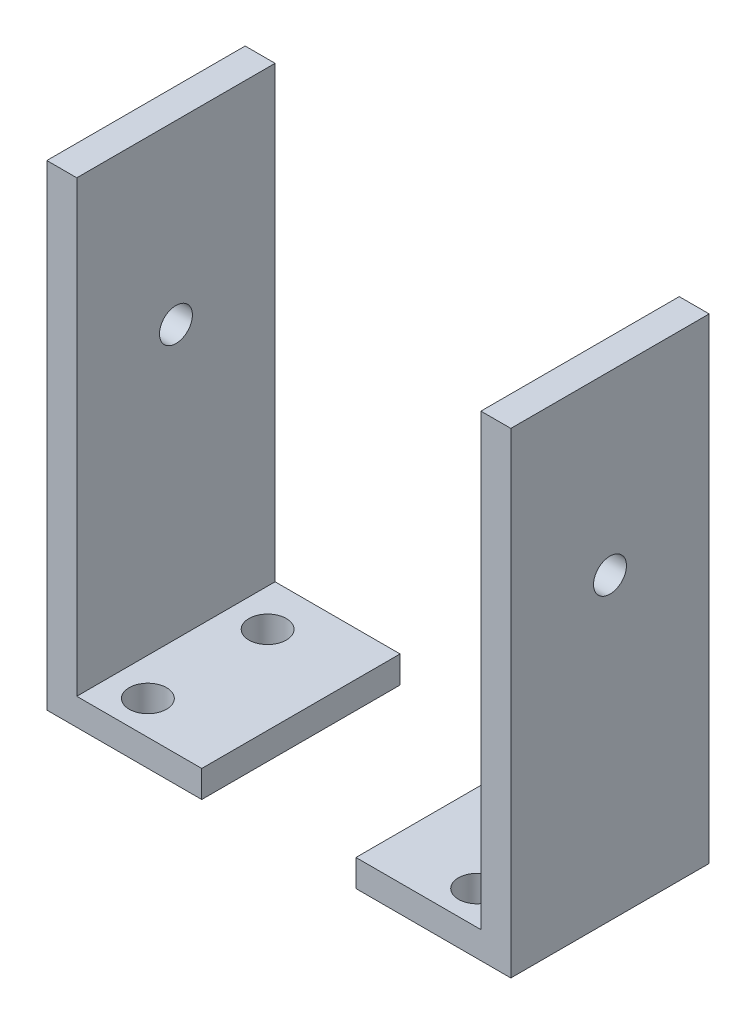
ISO-10303-21;
HEADER;
FILE_DESCRIPTION(('STEP AP214'),'2;1');
FILE_NAME('part.step','',(''),(''),'','','');
FILE_SCHEMA(('AUTOMOTIVE_DESIGN { 1 0 10303 214 1 1 1 1 }'));
ENDSEC;
DATA;
#1=APPLICATION_CONTEXT('core data for automotive mechanical design processes');
#2=APPLICATION_PROTOCOL_DEFINITION('international standard','automotive_design',2000,#1);
#3=PRODUCT_CONTEXT('',#1,'mechanical');
#4=PRODUCT('Part','Part','',(#3));
#5=PRODUCT_RELATED_PRODUCT_CATEGORY('part','',(#4));
#6=PRODUCT_DEFINITION_FORMATION('','',#4);
#7=PRODUCT_DEFINITION_CONTEXT('part definition',#1,'design');
#8=PRODUCT_DEFINITION('design','',#6,#7);
#9=PRODUCT_DEFINITION_SHAPE('','',#8);
#10=(LENGTH_UNIT() NAMED_UNIT(*) SI_UNIT(.MILLI.,.METRE.));
#11=(NAMED_UNIT(*) PLANE_ANGLE_UNIT() SI_UNIT($,.RADIAN.));
#12=(NAMED_UNIT(*) SI_UNIT($,.STERADIAN.) SOLID_ANGLE_UNIT());
#13=UNCERTAINTY_MEASURE_WITH_UNIT(LENGTH_MEASURE(1.E-05),#10,'distance_accuracy_value','');
#14=(GEOMETRIC_REPRESENTATION_CONTEXT(3) GLOBAL_UNCERTAINTY_ASSIGNED_CONTEXT((#13)) GLOBAL_UNIT_ASSIGNED_CONTEXT((#10,
#11,#12)) REPRESENTATION_CONTEXT('',''));
#15=CARTESIAN_POINT('',(0.,0.,0.));
#16=DIRECTION('',(0.,0.,1.));
#17=DIRECTION('',(1.,0.,0.));
#18=AXIS2_PLACEMENT_3D('',#15,#16,#17);
#19=CARTESIAN_POINT('',(2.,31.8,-13.25));
#20=DIRECTION('',(-1.,0.,0.));
#21=DIRECTION('',(0.,0.,1.));
#22=AXIS2_PLACEMENT_3D('',#19,#20,#21);
#23=PLANE('',#22);
#24=CARTESIAN_POINT('',(2.,20.,-6.625));
#25=DIRECTION('',(-1.,0.,0.));
#26=DIRECTION('',(0.,0.,1.));
#27=AXIS2_PLACEMENT_3D('',#24,#25,#26);
#28=CIRCLE('',#27,1.1);
#29=CARTESIAN_POINT('',(2.,20.,-5.525));
#30=VERTEX_POINT('',#29);
#31=EDGE_CURVE('E134',#30,#30,#28,.T.);
#32=ORIENTED_EDGE('',*,*,#31,.T.);
#33=EDGE_LOOP('',(#32));
#34=FACE_BOUND('',#33,.T.);
#35=DIRECTION('',(0.,0.,-1.));
#36=VECTOR('',#35,1.);
#37=CARTESIAN_POINT('',(2.,1.8,-13.25));
#38=LINE('',#37,#36);
#39=CARTESIAN_POINT('',(2.,1.8,0.));
#40=VERTEX_POINT('',#39);
#41=CARTESIAN_POINT('',(2.,1.8,-13.25));
#42=VERTEX_POINT('',#41);
#43=EDGE_CURVE('E129',#40,#42,#38,.T.);
#44=ORIENTED_EDGE('',*,*,#43,.T.);
#45=DIRECTION('',(0.,-1.,0.));
#46=VECTOR('',#45,1.);
#47=CARTESIAN_POINT('',(2.,31.8,-13.25));
#48=LINE('',#47,#46);
#49=CARTESIAN_POINT('',(2.,31.8,-13.25));
#50=VERTEX_POINT('',#49);
#51=EDGE_CURVE('E117',#50,#42,#48,.T.);
#52=ORIENTED_EDGE('',*,*,#51,.F.);
#53=DIRECTION('',(0.,0.,-1.));
#54=VECTOR('',#53,1.);
#55=CARTESIAN_POINT('',(2.,31.8,-13.25));
#56=LINE('',#55,#54);
#57=CARTESIAN_POINT('',(2.,31.8,0.));
#58=VERTEX_POINT('',#57);
#59=EDGE_CURVE('E138',#58,#50,#56,.T.);
#60=ORIENTED_EDGE('',*,*,#59,.F.);
#61=DIRECTION('',(0.,-1.,0.));
#62=VECTOR('',#61,1.);
#63=CARTESIAN_POINT('',(2.,31.8,0.));
#64=LINE('',#63,#62);
#65=EDGE_CURVE('E125',#58,#40,#64,.T.);
#66=ORIENTED_EDGE('',*,*,#65,.T.);
#67=EDGE_LOOP('',(#44,#52,#60,#66));
#68=FACE_BOUND('',#67,.T.);
#69=ADVANCED_FACE('F49',(#34,#68),#23,.F.);
#70=CARTESIAN_POINT('',(0.,31.8,0.));
#71=DIRECTION('',(0.,1.,0.));
#72=DIRECTION('',(0.,0.,1.));
#73=AXIS2_PLACEMENT_3D('',#70,#71,#72);
#74=PLANE('',#73);
#75=DIRECTION('',(0.,0.,1.));
#76=VECTOR('',#75,1.);
#77=CARTESIAN_POINT('',(0.,31.8,-13.25));
#78=LINE('',#77,#76);
#79=CARTESIAN_POINT('',(0.,31.8,-13.25));
#80=VERTEX_POINT('',#79);
#81=CARTESIAN_POINT('',(0.,31.8,0.));
#82=VERTEX_POINT('',#81);
#83=EDGE_CURVE('E128',#80,#82,#78,.T.);
#84=ORIENTED_EDGE('',*,*,#83,.T.);
#85=DIRECTION('',(1.,0.,0.));
#86=VECTOR('',#85,1.);
#87=CARTESIAN_POINT('',(0.,31.8,0.));
#88=LINE('',#87,#86);
#89=EDGE_CURVE('E140',#82,#58,#88,.T.);
#90=ORIENTED_EDGE('',*,*,#89,.T.);
#91=ORIENTED_EDGE('',*,*,#59,.T.);
#92=DIRECTION('',(-1.,0.,0.));
#93=VECTOR('',#92,1.);
#94=CARTESIAN_POINT('',(0.,31.8,-13.25));
#95=LINE('',#94,#93);
#96=EDGE_CURVE('E135',#50,#80,#95,.T.);
#97=ORIENTED_EDGE('',*,*,#96,.T.);
#98=EDGE_LOOP('',(#84,#90,#91,#97));
#99=FACE_BOUND('',#98,.T.);
#100=ADVANCED_FACE('F191',(#99),#74,.T.);
#101=CARTESIAN_POINT('',(0.,1.8,0.));
#102=DIRECTION('',(1.,0.,0.));
#103=DIRECTION('',(0.,0.,-1.));
#104=AXIS2_PLACEMENT_3D('',#101,#102,#103);
#105=PLANE('',#104);
#106=CARTESIAN_POINT('',(0.,20.,-6.625));
#107=DIRECTION('',(1.,0.,0.));
#108=DIRECTION('',(0.,0.,-1.));
#109=AXIS2_PLACEMENT_3D('',#106,#107,#108);
#110=CIRCLE('',#109,1.1);
#111=CARTESIAN_POINT('',(0.,20.,-7.725));
#112=VERTEX_POINT('',#111);
#113=EDGE_CURVE('E111',#112,#112,#110,.F.);
#114=ORIENTED_EDGE('',*,*,#113,.F.);
#115=EDGE_LOOP('',(#114));
#116=FACE_BOUND('',#115,.T.);
#117=DIRECTION('',(0.,0.,1.));
#118=VECTOR('',#117,1.);
#119=CARTESIAN_POINT('',(0.,0.,0.));
#120=LINE('',#119,#118);
#121=CARTESIAN_POINT('',(0.,0.,-13.25));
#122=VERTEX_POINT('',#121);
#123=CARTESIAN_POINT('',(0.,0.,0.));
#124=VERTEX_POINT('',#123);
#125=EDGE_CURVE('E122',#122,#124,#120,.T.);
#126=ORIENTED_EDGE('',*,*,#125,.T.);
#127=DIRECTION('',(0.,-1.,0.));
#128=VECTOR('',#127,1.);
#129=CARTESIAN_POINT('',(0.,1.8,0.));
#130=LINE('',#129,#128);
#131=EDGE_CURVE('E145',#82,#124,#130,.T.);
#132=ORIENTED_EDGE('',*,*,#131,.F.);
#133=ORIENTED_EDGE('',*,*,#83,.F.);
#134=DIRECTION('',(0.,-1.,0.));
#135=VECTOR('',#134,1.);
#136=CARTESIAN_POINT('',(0.,1.8,-13.25));
#137=LINE('',#136,#135);
#138=EDGE_CURVE('E179',#80,#122,#137,.T.);
#139=ORIENTED_EDGE('',*,*,#138,.T.);
#140=EDGE_LOOP('',(#126,#132,#133,#139));
#141=FACE_BOUND('',#140,.T.);
#142=ADVANCED_FACE('F189',(#116,#141),#105,.F.);
#143=CARTESIAN_POINT('',(0.,1.8,-13.25));
#144=DIRECTION('',(0.,0.,1.));
#145=DIRECTION('',(1.,0.,0.));
#146=AXIS2_PLACEMENT_3D('',#143,#144,#145);
#147=PLANE('',#146);
#148=DIRECTION('',(-1.,0.,0.));
#149=VECTOR('',#148,1.);
#150=CARTESIAN_POINT('',(0.,1.8,-13.25));
#151=LINE('',#150,#149);
#152=CARTESIAN_POINT('',(10.3492087080825,1.8,-13.25));
#153=VERTEX_POINT('',#152);
#154=EDGE_CURVE('E103',#153,#42,#151,.T.);
#155=ORIENTED_EDGE('',*,*,#154,.F.);
#156=DIRECTION('',(0.,1.,0.));
#157=VECTOR('',#156,1.);
#158=CARTESIAN_POINT('',(10.3492087080825,-16.7834771049259,-13.25));
#159=LINE('',#158,#157);
#160=CARTESIAN_POINT('',(10.3492087080825,0.,-13.25));
#161=VERTEX_POINT('',#160);
#162=EDGE_CURVE('E98',#161,#153,#159,.T.);
#163=ORIENTED_EDGE('',*,*,#162,.F.);
#164=DIRECTION('',(-1.,0.,0.));
#165=VECTOR('',#164,1.);
#166=CARTESIAN_POINT('',(0.,0.,-13.25));
#167=LINE('',#166,#165);
#168=EDGE_CURVE('E132',#161,#122,#167,.T.);
#169=ORIENTED_EDGE('',*,*,#168,.T.);
#170=ORIENTED_EDGE('',*,*,#138,.F.);
#171=ORIENTED_EDGE('',*,*,#96,.F.);
#172=ORIENTED_EDGE('',*,*,#51,.T.);
#173=EDGE_LOOP('',(#155,#163,#169,#170,#171,#172));
#174=FACE_BOUND('',#173,.T.);
#175=ADVANCED_FACE('F114',(#174),#147,.F.);
#176=CARTESIAN_POINT('',(0.,1.8,0.));
#177=DIRECTION('',(0.,0.,-1.));
#178=DIRECTION('',(-1.,0.,0.));
#179=AXIS2_PLACEMENT_3D('',#176,#177,#178);
#180=PLANE('',#179);
#181=DIRECTION('',(1.,0.,0.));
#182=VECTOR('',#181,1.);
#183=CARTESIAN_POINT('',(0.,0.,0.));
#184=LINE('',#183,#182);
#185=CARTESIAN_POINT('',(10.3492087080825,0.,0.));
#186=VERTEX_POINT('',#185);
#187=EDGE_CURVE('E131',#124,#186,#184,.T.);
#188=ORIENTED_EDGE('',*,*,#187,.T.);
#189=DIRECTION('',(0.,1.,0.));
#190=VECTOR('',#189,1.);
#191=CARTESIAN_POINT('',(10.3492087080825,-16.7834771049259,0.));
#192=LINE('',#191,#190);
#193=CARTESIAN_POINT('',(10.3492087080825,1.8,0.));
#194=VERTEX_POINT('',#193);
#195=EDGE_CURVE('E144',#186,#194,#192,.T.);
#196=ORIENTED_EDGE('',*,*,#195,.T.);
#197=DIRECTION('',(1.,0.,0.));
#198=VECTOR('',#197,1.);
#199=CARTESIAN_POINT('',(0.,1.8,0.));
#200=LINE('',#199,#198);
#201=EDGE_CURVE('E110',#40,#194,#200,.T.);
#202=ORIENTED_EDGE('',*,*,#201,.F.);
#203=ORIENTED_EDGE('',*,*,#65,.F.);
#204=ORIENTED_EDGE('',*,*,#89,.F.);
#205=ORIENTED_EDGE('',*,*,#131,.T.);
#206=EDGE_LOOP('',(#188,#196,#202,#203,#204,#205));
#207=FACE_BOUND('',#206,.T.);
#208=ADVANCED_FACE('F163',(#207),#180,.F.);
#209=CARTESIAN_POINT('',(0.,0.,0.));
#210=DIRECTION('',(0.,-1.,0.));
#211=DIRECTION('',(0.,0.,-1.));
#212=AXIS2_PLACEMENT_3D('',#209,#210,#211);
#213=PLANE('',#212);
#214=DIRECTION('',(0.,0.,1.));
#215=VECTOR('',#214,1.);
#216=CARTESIAN_POINT('',(10.3492087080825,0.,-13.25));
#217=LINE('',#216,#215);
#218=EDGE_CURVE('E66',#161,#186,#217,.T.);
#219=ORIENTED_EDGE('',*,*,#218,.T.);
#220=ORIENTED_EDGE('',*,*,#187,.F.);
#221=ORIENTED_EDGE('',*,*,#125,.F.);
#222=ORIENTED_EDGE('',*,*,#168,.F.);
#223=EDGE_LOOP('',(#219,#220,#221,#222));
#224=FACE_BOUND('',#223,.T.);
#225=CARTESIAN_POINT('',(4.5,0.,-10.25));
#226=DIRECTION('',(0.,-1.,0.));
#227=DIRECTION('',(0.,0.,-1.));
#228=AXIS2_PLACEMENT_3D('',#225,#226,#227);
#229=CIRCLE('',#228,1.25);
#230=CARTESIAN_POINT('',(4.5,0.,-11.5));
#231=VERTEX_POINT('',#230);
#232=EDGE_CURVE('E53',#231,#231,#229,.T.);
#233=ORIENTED_EDGE('',*,*,#232,.F.);
#234=EDGE_LOOP('',(#233));
#235=FACE_BOUND('',#234,.T.);
#236=CARTESIAN_POINT('',(4.5,0.,-2.25));
#237=DIRECTION('',(0.,-1.,0.));
#238=DIRECTION('',(0.,0.,-1.));
#239=AXIS2_PLACEMENT_3D('',#236,#237,#238);
#240=CIRCLE('',#239,1.25);
#241=CARTESIAN_POINT('',(4.5,0.,-3.5));
#242=VERTEX_POINT('',#241);
#243=EDGE_CURVE('E12',#242,#242,#240,.T.);
#244=ORIENTED_EDGE('',*,*,#243,.F.);
#245=EDGE_LOOP('',(#244));
#246=FACE_BOUND('',#245,.T.);
#247=ADVANCED_FACE('F160',(#224,#235,#246),#213,.T.);
#248=CARTESIAN_POINT('',(0.,1.8,0.));
#249=DIRECTION('',(0.,-1.,0.));
#250=DIRECTION('',(0.,0.,-1.));
#251=AXIS2_PLACEMENT_3D('',#248,#249,#250);
#252=PLANE('',#251);
#253=CARTESIAN_POINT('',(4.5,1.8,-2.25));
#254=DIRECTION('',(0.,-1.,0.));
#255=DIRECTION('',(0.,0.,-1.));
#256=AXIS2_PLACEMENT_3D('',#253,#254,#255);
#257=CIRCLE('',#256,1.25);
#258=CARTESIAN_POINT('',(4.5,1.8,-3.5));
#259=VERTEX_POINT('',#258);
#260=EDGE_CURVE('E147',#259,#259,#257,.T.);
#261=ORIENTED_EDGE('',*,*,#260,.T.);
#262=EDGE_LOOP('',(#261));
#263=FACE_BOUND('',#262,.T.);
#264=CARTESIAN_POINT('',(4.5,1.8,-10.25));
#265=DIRECTION('',(0.,-1.,0.));
#266=DIRECTION('',(0.,0.,-1.));
#267=AXIS2_PLACEMENT_3D('',#264,#265,#266);
#268=CIRCLE('',#267,1.25);
#269=CARTESIAN_POINT('',(4.5,1.8,-11.5));
#270=VERTEX_POINT('',#269);
#271=EDGE_CURVE('E119',#270,#270,#268,.T.);
#272=ORIENTED_EDGE('',*,*,#271,.T.);
#273=EDGE_LOOP('',(#272));
#274=FACE_BOUND('',#273,.T.);
#275=ORIENTED_EDGE('',*,*,#201,.T.);
#276=DIRECTION('',(0.,0.,1.));
#277=VECTOR('',#276,1.);
#278=CARTESIAN_POINT('',(10.3492087080825,1.8,-13.25));
#279=LINE('',#278,#277);
#280=EDGE_CURVE('E96',#153,#194,#279,.T.);
#281=ORIENTED_EDGE('',*,*,#280,.F.);
#282=ORIENTED_EDGE('',*,*,#154,.T.);
#283=ORIENTED_EDGE('',*,*,#43,.F.);
#284=EDGE_LOOP('',(#275,#281,#282,#283));
#285=FACE_BOUND('',#284,.T.);
#286=ADVANCED_FACE('F107',(#263,#274,#285),#252,.F.);
#287=CARTESIAN_POINT('',(10.3492087080825,-16.7834771049259,-13.25));
#288=DIRECTION('',(-1.,0.,0.));
#289=DIRECTION('',(0.,0.,1.));
#290=AXIS2_PLACEMENT_3D('',#287,#288,#289);
#291=PLANE('',#290);
#292=ORIENTED_EDGE('',*,*,#162,.T.);
#293=ORIENTED_EDGE('',*,*,#280,.T.);
#294=ORIENTED_EDGE('',*,*,#195,.F.);
#295=ORIENTED_EDGE('',*,*,#218,.F.);
#296=EDGE_LOOP('',(#292,#293,#294,#295));
#297=FACE_BOUND('',#296,.T.);
#298=ADVANCED_FACE('F99',(#297),#291,.F.);
#299=CARTESIAN_POINT('',(-3.11126983722081,20.,-6.625));
#300=DIRECTION('',(1.,0.,0.));
#301=DIRECTION('',(0.,0.,-1.));
#302=AXIS2_PLACEMENT_3D('',#299,#300,#301);
#303=CYLINDRICAL_SURFACE('',#302,1.1);
#304=ORIENTED_EDGE('',*,*,#113,.T.);
#305=EDGE_LOOP('',(#304));
#306=FACE_BOUND('',#305,.T.);
#307=ORIENTED_EDGE('',*,*,#31,.F.);
#308=EDGE_LOOP('',(#307));
#309=FACE_BOUND('',#308,.T.);
#310=ADVANCED_FACE('F206',(#306,#309),#303,.F.);
#311=CARTESIAN_POINT('',(4.5,10.,-10.25));
#312=DIRECTION('',(0.,-1.,0.));
#313=DIRECTION('',(0.,0.,-1.));
#314=AXIS2_PLACEMENT_3D('',#311,#312,#313);
#315=CYLINDRICAL_SURFACE('',#314,1.25);
#316=ORIENTED_EDGE('',*,*,#232,.T.);
#317=EDGE_LOOP('',(#316));
#318=FACE_BOUND('',#317,.T.);
#319=ORIENTED_EDGE('',*,*,#271,.F.);
#320=EDGE_LOOP('',(#319));
#321=FACE_BOUND('',#320,.T.);
#322=ADVANCED_FACE('F157',(#318,#321),#315,.F.);
#323=CARTESIAN_POINT('',(4.5,10.,-2.25));
#324=DIRECTION('',(0.,-1.,0.));
#325=DIRECTION('',(0.,0.,-1.));
#326=AXIS2_PLACEMENT_3D('',#323,#324,#325);
#327=CYLINDRICAL_SURFACE('',#326,1.25);
#328=ORIENTED_EDGE('',*,*,#243,.T.);
#329=EDGE_LOOP('',(#328));
#330=FACE_BOUND('',#329,.T.);
#331=ORIENTED_EDGE('',*,*,#260,.F.);
#332=EDGE_LOOP('',(#331));
#333=FACE_BOUND('',#332,.T.);
#334=ADVANCED_FACE('F51',(#330,#333),#327,.F.);
#335=CLOSED_SHELL('',(#69,#100,#142,#175,#208,#247,#286,#298,#310,#322,#334));
#336=MANIFOLD_SOLID_BREP('B2',#335);
#337=CARTESIAN_POINT('',(0.,1.8,0.));
#338=DIRECTION('',(0.,-1.,0.));
#339=DIRECTION('',(0.,0.,-1.));
#340=AXIS2_PLACEMENT_3D('',#337,#338,#339);
#341=PLANE('',#340);
#342=CARTESIAN_POINT('',(26.5,1.8,-2.25));
#343=DIRECTION('',(0.,-1.,0.));
#344=DIRECTION('',(0.,0.,-1.));
#345=AXIS2_PLACEMENT_3D('',#342,#343,#344);
#346=CIRCLE('',#345,1.25);
#347=CARTESIAN_POINT('',(26.5,1.8,-3.5));
#348=VERTEX_POINT('',#347);
#349=EDGE_CURVE('E472',#348,#348,#346,.T.);
#350=ORIENTED_EDGE('',*,*,#349,.T.);
#351=EDGE_LOOP('',(#350));
#352=FACE_BOUND('',#351,.T.);
#353=CARTESIAN_POINT('',(26.5,1.8,-10.25));
#354=DIRECTION('',(0.,-1.,0.));
#355=DIRECTION('',(0.,0.,-1.));
#356=AXIS2_PLACEMENT_3D('',#353,#354,#355);
#357=CIRCLE('',#356,1.25);
#358=CARTESIAN_POINT('',(26.5,1.8,-11.5));
#359=VERTEX_POINT('',#358);
#360=EDGE_CURVE('E475',#359,#359,#357,.T.);
#361=ORIENTED_EDGE('',*,*,#360,.T.);
#362=EDGE_LOOP('',(#361));
#363=FACE_BOUND('',#362,.T.);
#364=DIRECTION('',(-1.,0.,0.));
#365=VECTOR('',#364,1.);
#366=CARTESIAN_POINT('',(0.,1.8,-13.25));
#367=LINE('',#366,#365);
#368=CARTESIAN_POINT('',(29.,1.8,-13.25));
#369=VERTEX_POINT('',#368);
#370=CARTESIAN_POINT('',(20.6507912919175,1.8,-13.25));
#371=VERTEX_POINT('',#370);
#372=EDGE_CURVE('E429',#369,#371,#367,.T.);
#373=ORIENTED_EDGE('',*,*,#372,.T.);
#374=DIRECTION('',(0.,0.,-1.));
#375=VECTOR('',#374,1.);
#376=CARTESIAN_POINT('',(20.6507912919175,1.8,-13.25));
#377=LINE('',#376,#375);
#378=CARTESIAN_POINT('',(20.6507912919175,1.8,0.));
#379=VERTEX_POINT('',#378);
#380=EDGE_CURVE('E427',#379,#371,#377,.T.);
#381=ORIENTED_EDGE('',*,*,#380,.F.);
#382=DIRECTION('',(1.,0.,0.));
#383=VECTOR('',#382,1.);
#384=CARTESIAN_POINT('',(0.,1.8,0.));
#385=LINE('',#384,#383);
#386=CARTESIAN_POINT('',(29.,1.8,0.));
#387=VERTEX_POINT('',#386);
#388=EDGE_CURVE('E420',#379,#387,#385,.T.);
#389=ORIENTED_EDGE('',*,*,#388,.T.);
#390=DIRECTION('',(0.,0.,1.));
#391=VECTOR('',#390,1.);
#392=CARTESIAN_POINT('',(29.,1.8,-13.25));
#393=LINE('',#392,#391);
#394=EDGE_CURVE('E424',#369,#387,#393,.T.);
#395=ORIENTED_EDGE('',*,*,#394,.F.);
#396=EDGE_LOOP('',(#373,#381,#389,#395));
#397=FACE_BOUND('',#396,.T.);
#398=ADVANCED_FACE('F371',(#352,#363,#397),#341,.F.);
#399=CARTESIAN_POINT('',(0.,0.,0.));
#400=DIRECTION('',(0.,-1.,0.));
#401=DIRECTION('',(0.,0.,-1.));
#402=AXIS2_PLACEMENT_3D('',#399,#400,#401);
#403=PLANE('',#402);
#404=DIRECTION('',(0.,0.,-1.));
#405=VECTOR('',#404,1.);
#406=CARTESIAN_POINT('',(20.6507912919175,0.,-13.25));
#407=LINE('',#406,#405);
#408=CARTESIAN_POINT('',(20.6507912919175,0.,0.));
#409=VERTEX_POINT('',#408);
#410=CARTESIAN_POINT('',(20.6507912919175,0.,-13.25));
#411=VERTEX_POINT('',#410);
#412=EDGE_CURVE('E388',#409,#411,#407,.T.);
#413=ORIENTED_EDGE('',*,*,#412,.T.);
#414=DIRECTION('',(-1.,0.,0.));
#415=VECTOR('',#414,1.);
#416=CARTESIAN_POINT('',(0.,0.,-13.25));
#417=LINE('',#416,#415);
#418=CARTESIAN_POINT('',(31.,0.,-13.25));
#419=VERTEX_POINT('',#418);
#420=EDGE_CURVE('E439',#419,#411,#417,.T.);
#421=ORIENTED_EDGE('',*,*,#420,.F.);
#422=DIRECTION('',(0.,0.,-1.));
#423=VECTOR('',#422,1.);
#424=CARTESIAN_POINT('',(31.,0.,0.));
#425=LINE('',#424,#423);
#426=CARTESIAN_POINT('',(31.,0.,0.));
#427=VERTEX_POINT('',#426);
#428=EDGE_CURVE('E461',#427,#419,#425,.T.);
#429=ORIENTED_EDGE('',*,*,#428,.F.);
#430=DIRECTION('',(1.,0.,0.));
#431=VECTOR('',#430,1.);
#432=CARTESIAN_POINT('',(0.,0.,0.));
#433=LINE('',#432,#431);
#434=EDGE_CURVE('E440',#409,#427,#433,.T.);
#435=ORIENTED_EDGE('',*,*,#434,.F.);
#436=EDGE_LOOP('',(#413,#421,#429,#435));
#437=FACE_BOUND('',#436,.T.);
#438=CARTESIAN_POINT('',(26.5,0.,-2.25));
#439=DIRECTION('',(0.,-1.,0.));
#440=DIRECTION('',(0.,0.,-1.));
#441=AXIS2_PLACEMENT_3D('',#438,#439,#440);
#442=CIRCLE('',#441,1.25);
#443=CARTESIAN_POINT('',(26.5,0.,-3.5));
#444=VERTEX_POINT('',#443);
#445=EDGE_CURVE('E47',#444,#444,#442,.T.);
#446=ORIENTED_EDGE('',*,*,#445,.F.);
#447=EDGE_LOOP('',(#446));
#448=FACE_BOUND('',#447,.T.);
#449=CARTESIAN_POINT('',(26.5,0.,-10.25));
#450=DIRECTION('',(0.,-1.,0.));
#451=DIRECTION('',(0.,0.,-1.));
#452=AXIS2_PLACEMENT_3D('',#449,#450,#451);
#453=CIRCLE('',#452,1.25);
#454=CARTESIAN_POINT('',(26.5,0.,-11.5));
#455=VERTEX_POINT('',#454);
#456=EDGE_CURVE('E375',#455,#455,#453,.T.);
#457=ORIENTED_EDGE('',*,*,#456,.F.);
#458=EDGE_LOOP('',(#457));
#459=FACE_BOUND('',#458,.T.);
#460=ADVANCED_FACE('F490',(#437,#448,#459),#403,.T.);
#461=CARTESIAN_POINT('',(0.,1.8,0.));
#462=DIRECTION('',(0.,0.,-1.));
#463=DIRECTION('',(-1.,0.,0.));
#464=AXIS2_PLACEMENT_3D('',#461,#462,#463);
#465=PLANE('',#464);
#466=ORIENTED_EDGE('',*,*,#388,.F.);
#467=DIRECTION('',(0.,1.,0.));
#468=VECTOR('',#467,1.);
#469=CARTESIAN_POINT('',(20.6507912919175,-16.7834771049259,0.));
#470=LINE('',#469,#468);
#471=EDGE_CURVE('E455',#409,#379,#470,.T.);
#472=ORIENTED_EDGE('',*,*,#471,.F.);
#473=ORIENTED_EDGE('',*,*,#434,.T.);
#474=DIRECTION('',(0.,-1.,0.));
#475=VECTOR('',#474,1.);
#476=CARTESIAN_POINT('',(31.,1.8,0.));
#477=LINE('',#476,#475);
#478=CARTESIAN_POINT('',(31.,31.8,0.));
#479=VERTEX_POINT('',#478);
#480=EDGE_CURVE('E450',#479,#427,#477,.T.);
#481=ORIENTED_EDGE('',*,*,#480,.F.);
#482=DIRECTION('',(1.,0.,0.));
#483=VECTOR('',#482,1.);
#484=CARTESIAN_POINT('',(29.,31.8,0.));
#485=LINE('',#484,#483);
#486=CARTESIAN_POINT('',(29.,31.8,0.));
#487=VERTEX_POINT('',#486);
#488=EDGE_CURVE('E435',#487,#479,#485,.T.);
#489=ORIENTED_EDGE('',*,*,#488,.F.);
#490=DIRECTION('',(0.,-1.,0.));
#491=VECTOR('',#490,1.);
#492=CARTESIAN_POINT('',(29.,31.8,0.));
#493=LINE('',#492,#491);
#494=EDGE_CURVE('E432',#487,#387,#493,.T.);
#495=ORIENTED_EDGE('',*,*,#494,.T.);
#496=EDGE_LOOP('',(#466,#472,#473,#481,#489,#495));
#497=FACE_BOUND('',#496,.T.);
#498=ADVANCED_FACE('F433',(#497),#465,.F.);
#499=CARTESIAN_POINT('',(0.,1.8,-13.25));
#500=DIRECTION('',(0.,0.,1.));
#501=DIRECTION('',(1.,0.,0.));
#502=AXIS2_PLACEMENT_3D('',#499,#500,#501);
#503=PLANE('',#502);
#504=ORIENTED_EDGE('',*,*,#420,.T.);
#505=DIRECTION('',(0.,1.,0.));
#506=VECTOR('',#505,1.);
#507=CARTESIAN_POINT('',(20.6507912919175,-16.7834771049259,-13.25));
#508=LINE('',#507,#506);
#509=EDGE_CURVE('E466',#411,#371,#508,.T.);
#510=ORIENTED_EDGE('',*,*,#509,.T.);
#511=ORIENTED_EDGE('',*,*,#372,.F.);
#512=DIRECTION('',(0.,-1.,0.));
#513=VECTOR('',#512,1.);
#514=CARTESIAN_POINT('',(29.,31.8,-13.25));
#515=LINE('',#514,#513);
#516=CARTESIAN_POINT('',(29.,31.8,-13.25));
#517=VERTEX_POINT('',#516);
#518=EDGE_CURVE('E444',#517,#369,#515,.T.);
#519=ORIENTED_EDGE('',*,*,#518,.F.);
#520=DIRECTION('',(-1.,0.,0.));
#521=VECTOR('',#520,1.);
#522=CARTESIAN_POINT('',(29.,31.8,-13.25));
#523=LINE('',#522,#521);
#524=CARTESIAN_POINT('',(31.,31.8,-13.25));
#525=VERTEX_POINT('',#524);
#526=EDGE_CURVE('E453',#525,#517,#523,.T.);
#527=ORIENTED_EDGE('',*,*,#526,.F.);
#528=DIRECTION('',(0.,-1.,0.));
#529=VECTOR('',#528,1.);
#530=CARTESIAN_POINT('',(31.,1.8,-13.25));
#531=LINE('',#530,#529);
#532=EDGE_CURVE('E463',#525,#419,#531,.T.);
#533=ORIENTED_EDGE('',*,*,#532,.T.);
#534=EDGE_LOOP('',(#504,#510,#511,#519,#527,#533));
#535=FACE_BOUND('',#534,.T.);
#536=ADVANCED_FACE('F496',(#535),#503,.F.);
#537=CARTESIAN_POINT('',(31.,1.8,0.));
#538=DIRECTION('',(-1.,0.,0.));
#539=DIRECTION('',(0.,0.,1.));
#540=AXIS2_PLACEMENT_3D('',#537,#538,#539);
#541=PLANE('',#540);
#542=CARTESIAN_POINT('',(31.,20.,-6.625));
#543=DIRECTION('',(1.,0.,0.));
#544=DIRECTION('',(0.,0.,-1.));
#545=AXIS2_PLACEMENT_3D('',#542,#543,#544);
#546=CIRCLE('',#545,1.1);
#547=CARTESIAN_POINT('',(31.,20.,-7.725));
#548=VERTEX_POINT('',#547);
#549=EDGE_CURVE('E469',#548,#548,#546,.T.);
#550=ORIENTED_EDGE('',*,*,#549,.F.);
#551=EDGE_LOOP('',(#550));
#552=FACE_BOUND('',#551,.T.);
#553=ORIENTED_EDGE('',*,*,#428,.T.);
#554=ORIENTED_EDGE('',*,*,#532,.F.);
#555=DIRECTION('',(0.,0.,-1.));
#556=VECTOR('',#555,1.);
#557=CARTESIAN_POINT('',(31.,31.8,-13.25));
#558=LINE('',#557,#556);
#559=EDGE_CURVE('E456',#479,#525,#558,.T.);
#560=ORIENTED_EDGE('',*,*,#559,.F.);
#561=ORIENTED_EDGE('',*,*,#480,.T.);
#562=EDGE_LOOP('',(#553,#554,#560,#561));
#563=FACE_BOUND('',#562,.T.);
#564=ADVANCED_FACE('F500',(#552,#563),#541,.F.);
#565=CARTESIAN_POINT('',(29.,31.8,-13.25));
#566=DIRECTION('',(1.,0.,0.));
#567=DIRECTION('',(0.,0.,-1.));
#568=AXIS2_PLACEMENT_3D('',#565,#566,#567);
#569=PLANE('',#568);
#570=CARTESIAN_POINT('',(29.,20.,-6.625));
#571=DIRECTION('',(1.,0.,0.));
#572=DIRECTION('',(0.,0.,-1.));
#573=AXIS2_PLACEMENT_3D('',#570,#571,#572);
#574=CIRCLE('',#573,1.1);
#575=CARTESIAN_POINT('',(29.,20.,-7.725));
#576=VERTEX_POINT('',#575);
#577=EDGE_CURVE('E445',#576,#576,#574,.T.);
#578=ORIENTED_EDGE('',*,*,#577,.T.);
#579=EDGE_LOOP('',(#578));
#580=FACE_BOUND('',#579,.T.);
#581=ORIENTED_EDGE('',*,*,#394,.T.);
#582=ORIENTED_EDGE('',*,*,#494,.F.);
#583=DIRECTION('',(0.,0.,1.));
#584=VECTOR('',#583,1.);
#585=CARTESIAN_POINT('',(29.,31.8,-13.25));
#586=LINE('',#585,#584);
#587=EDGE_CURVE('E447',#517,#487,#586,.T.);
#588=ORIENTED_EDGE('',*,*,#587,.F.);
#589=ORIENTED_EDGE('',*,*,#518,.T.);
#590=EDGE_LOOP('',(#581,#582,#588,#589));
#591=FACE_BOUND('',#590,.T.);
#592=ADVANCED_FACE('F442',(#580,#591),#569,.F.);
#593=CARTESIAN_POINT('',(0.,31.8,0.));
#594=DIRECTION('',(0.,1.,0.));
#595=DIRECTION('',(0.,0.,1.));
#596=AXIS2_PLACEMENT_3D('',#593,#594,#595);
#597=PLANE('',#596);
#598=ORIENTED_EDGE('',*,*,#587,.T.);
#599=ORIENTED_EDGE('',*,*,#488,.T.);
#600=ORIENTED_EDGE('',*,*,#559,.T.);
#601=ORIENTED_EDGE('',*,*,#526,.T.);
#602=EDGE_LOOP('',(#598,#599,#600,#601));
#603=FACE_BOUND('',#602,.T.);
#604=ADVANCED_FACE('F502',(#603),#597,.T.);
#605=CARTESIAN_POINT('',(20.6507912919175,-16.7834771049259,-13.25));
#606=DIRECTION('',(1.,0.,0.));
#607=DIRECTION('',(0.,0.,-1.));
#608=AXIS2_PLACEMENT_3D('',#605,#606,#607);
#609=PLANE('',#608);
#610=ORIENTED_EDGE('',*,*,#471,.T.);
#611=ORIENTED_EDGE('',*,*,#380,.T.);
#612=ORIENTED_EDGE('',*,*,#509,.F.);
#613=ORIENTED_EDGE('',*,*,#412,.F.);
#614=EDGE_LOOP('',(#610,#611,#612,#613));
#615=FACE_BOUND('',#614,.T.);
#616=ADVANCED_FACE('F486',(#615),#609,.F.);
#617=CARTESIAN_POINT('',(-3.11126983722081,20.,-6.625));
#618=DIRECTION('',(1.,0.,0.));
#619=DIRECTION('',(0.,0.,-1.));
#620=AXIS2_PLACEMENT_3D('',#617,#618,#619);
#621=CYLINDRICAL_SURFACE('',#620,1.1);
#622=ORIENTED_EDGE('',*,*,#549,.T.);
#623=EDGE_LOOP('',(#622));
#624=FACE_BOUND('',#623,.T.);
#625=ORIENTED_EDGE('',*,*,#577,.F.);
#626=EDGE_LOOP('',(#625));
#627=FACE_BOUND('',#626,.T.);
#628=ADVANCED_FACE('F509',(#624,#627),#621,.F.);
#629=CARTESIAN_POINT('',(26.5,10.,-10.25));
#630=DIRECTION('',(0.,-1.,0.));
#631=DIRECTION('',(0.,0.,-1.));
#632=AXIS2_PLACEMENT_3D('',#629,#630,#631);
#633=CYLINDRICAL_SURFACE('',#632,1.25);
#634=ORIENTED_EDGE('',*,*,#456,.T.);
#635=EDGE_LOOP('',(#634));
#636=FACE_BOUND('',#635,.T.);
#637=ORIENTED_EDGE('',*,*,#360,.F.);
#638=EDGE_LOOP('',(#637));
#639=FACE_BOUND('',#638,.T.);
#640=ADVANCED_FACE('F534',(#636,#639),#633,.F.);
#641=CARTESIAN_POINT('',(26.5,10.,-2.25));
#642=DIRECTION('',(0.,-1.,0.));
#643=DIRECTION('',(0.,0.,-1.));
#644=AXIS2_PLACEMENT_3D('',#641,#642,#643);
#645=CYLINDRICAL_SURFACE('',#644,1.25);
#646=ORIENTED_EDGE('',*,*,#445,.T.);
#647=EDGE_LOOP('',(#646));
#648=FACE_BOUND('',#647,.T.);
#649=ORIENTED_EDGE('',*,*,#349,.F.);
#650=EDGE_LOOP('',(#649));
#651=FACE_BOUND('',#650,.T.);
#652=ADVANCED_FACE('F373',(#648,#651),#645,.F.);
#653=CLOSED_SHELL('',(#398,#460,#498,#536,#564,#592,#604,#616,#628,#640,#652));
#654=MANIFOLD_SOLID_BREP('B6',#653);
#655=ADVANCED_BREP_SHAPE_REPRESENTATION('',(#18,#336,#654),#14);
#656=SHAPE_DEFINITION_REPRESENTATION(#9,#655);
ENDSEC;
END-ISO-10303-21;
